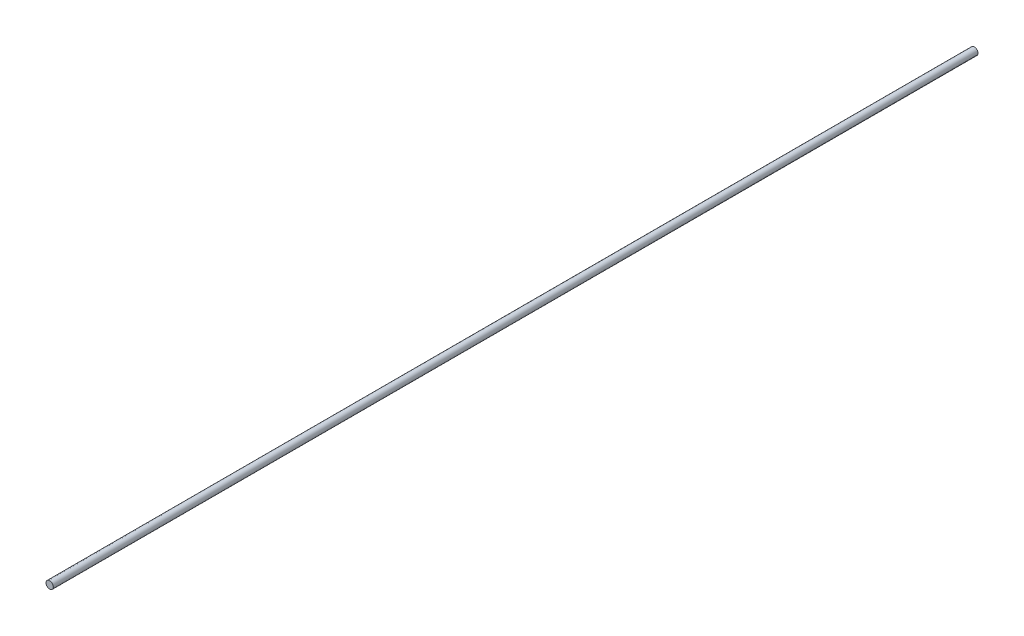
ISO-10303-21;
HEADER;
FILE_DESCRIPTION(('STEP AP214'),'2;1');
FILE_NAME('part.step','',(''),(''),'','','');
FILE_SCHEMA(('AUTOMOTIVE_DESIGN { 1 0 10303 214 1 1 1 1 }'));
ENDSEC;
DATA;
#1=APPLICATION_CONTEXT('core data for automotive mechanical design processes');
#2=APPLICATION_PROTOCOL_DEFINITION('international standard','automotive_design',2000,#1);
#3=PRODUCT_CONTEXT('',#1,'mechanical');
#4=PRODUCT('Part','Part','',(#3));
#5=PRODUCT_RELATED_PRODUCT_CATEGORY('part','',(#4));
#6=PRODUCT_DEFINITION_FORMATION('','',#4);
#7=PRODUCT_DEFINITION_CONTEXT('part definition',#1,'design');
#8=PRODUCT_DEFINITION('design','',#6,#7);
#9=PRODUCT_DEFINITION_SHAPE('','',#8);
#10=(LENGTH_UNIT() NAMED_UNIT(*) SI_UNIT(.MILLI.,.METRE.));
#11=(NAMED_UNIT(*) PLANE_ANGLE_UNIT() SI_UNIT($,.RADIAN.));
#12=(NAMED_UNIT(*) SI_UNIT($,.STERADIAN.) SOLID_ANGLE_UNIT());
#13=UNCERTAINTY_MEASURE_WITH_UNIT(LENGTH_MEASURE(1.E-05),#10,'distance_accuracy_value','');
#14=(GEOMETRIC_REPRESENTATION_CONTEXT(3) GLOBAL_UNCERTAINTY_ASSIGNED_CONTEXT((#13)) GLOBAL_UNIT_ASSIGNED_CONTEXT((#10,
#11,#12)) REPRESENTATION_CONTEXT('',''));
#15=CARTESIAN_POINT('',(0.,0.,0.));
#16=DIRECTION('',(0.,0.,1.));
#17=DIRECTION('',(1.,0.,0.));
#18=AXIS2_PLACEMENT_3D('',#15,#16,#17);
#19=CARTESIAN_POINT('',(0.,0.,0.));
#20=DIRECTION('',(0.,0.,-1.));
#21=DIRECTION('',(-1.,0.,0.));
#22=AXIS2_PLACEMENT_3D('',#19,#20,#21);
#23=PLANE('',#22);
#24=CARTESIAN_POINT('',(0.,0.,0.));
#25=DIRECTION('',(0.,0.,1.));
#26=DIRECTION('',(1.,0.,0.));
#27=AXIS2_PLACEMENT_3D('',#24,#25,#26);
#28=CIRCLE('',#27,0.75);
#29=CARTESIAN_POINT('',(0.75,0.,0.));
#30=VERTEX_POINT('',#29);
#31=EDGE_CURVE('E10',#30,#30,#28,.T.);
#32=ORIENTED_EDGE('',*,*,#31,.T.);
#33=EDGE_LOOP('',(#32));
#34=FACE_BOUND('',#33,.T.);
#35=ADVANCED_FACE('F31',(#34),#23,.F.);
#36=CARTESIAN_POINT('',(0.,0.,0.));
#37=DIRECTION('',(0.,0.,1.));
#38=DIRECTION('',(1.,0.,0.));
#39=AXIS2_PLACEMENT_3D('',#36,#37,#38);
#40=CYLINDRICAL_SURFACE('',#39,0.75);
#41=ORIENTED_EDGE('',*,*,#31,.F.);
#42=EDGE_LOOP('',(#41));
#43=FACE_BOUND('',#42,.T.);
#44=CARTESIAN_POINT('',(0.,0.,-190.));
#45=DIRECTION('',(0.,0.,1.));
#46=DIRECTION('',(1.,0.,0.));
#47=AXIS2_PLACEMENT_3D('',#44,#45,#46);
#48=CIRCLE('',#47,0.75);
#49=CARTESIAN_POINT('',(0.75,0.,-190.));
#50=VERTEX_POINT('',#49);
#51=EDGE_CURVE('E37',#50,#50,#48,.T.);
#52=ORIENTED_EDGE('',*,*,#51,.T.);
#53=EDGE_LOOP('',(#52));
#54=FACE_BOUND('',#53,.T.);
#55=ADVANCED_FACE('F43',(#43,#54),#40,.T.);
#56=CARTESIAN_POINT('',(0.,0.,-190.));
#57=DIRECTION('',(0.,0.,1.));
#58=DIRECTION('',(1.,0.,0.));
#59=AXIS2_PLACEMENT_3D('',#56,#57,#58);
#60=PLANE('',#59);
#61=ORIENTED_EDGE('',*,*,#51,.F.);
#62=EDGE_LOOP('',(#61));
#63=FACE_BOUND('',#62,.T.);
#64=ADVANCED_FACE('F45',(#63),#60,.F.);
#65=CLOSED_SHELL('',(#35,#55,#64));
#66=MANIFOLD_SOLID_BREP('B2',#65);
#67=ADVANCED_BREP_SHAPE_REPRESENTATION('',(#18,#66),#14);
#68=SHAPE_DEFINITION_REPRESENTATION(#9,#67);
ENDSEC;
END-ISO-10303-21;
